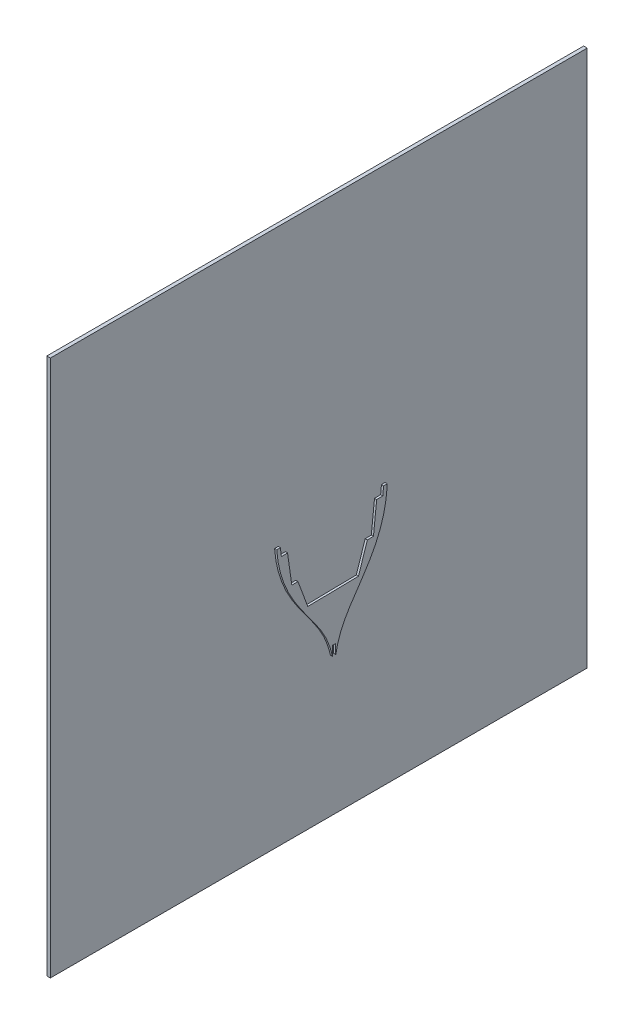
ISO-10303-21;
HEADER;
FILE_DESCRIPTION(('STEP AP214'),'2;1');
FILE_NAME('part.step','',(''),(''),'','','');
FILE_SCHEMA(('AUTOMOTIVE_DESIGN { 1 0 10303 214 1 1 1 1 }'));
ENDSEC;
DATA;
#1=APPLICATION_CONTEXT('core data for automotive mechanical design processes');
#2=APPLICATION_PROTOCOL_DEFINITION('international standard','automotive_design',2000,#1);
#3=PRODUCT_CONTEXT('',#1,'mechanical');
#4=PRODUCT('Part','Part','',(#3));
#5=PRODUCT_RELATED_PRODUCT_CATEGORY('part','',(#4));
#6=PRODUCT_DEFINITION_FORMATION('','',#4);
#7=PRODUCT_DEFINITION_CONTEXT('part definition',#1,'design');
#8=PRODUCT_DEFINITION('design','',#6,#7);
#9=PRODUCT_DEFINITION_SHAPE('','',#8);
#10=(LENGTH_UNIT() NAMED_UNIT(*) SI_UNIT(.MILLI.,.METRE.));
#11=(NAMED_UNIT(*) PLANE_ANGLE_UNIT() SI_UNIT($,.RADIAN.));
#12=(NAMED_UNIT(*) SI_UNIT($,.STERADIAN.) SOLID_ANGLE_UNIT());
#13=UNCERTAINTY_MEASURE_WITH_UNIT(LENGTH_MEASURE(1.E-05),#10,'distance_accuracy_value','');
#14=(GEOMETRIC_REPRESENTATION_CONTEXT(3) GLOBAL_UNCERTAINTY_ASSIGNED_CONTEXT((#13)) GLOBAL_UNIT_ASSIGNED_CONTEXT((#10,
#11,#12)) REPRESENTATION_CONTEXT('',''));
#15=CARTESIAN_POINT('',(0.,0.,0.));
#16=DIRECTION('',(0.,0.,1.));
#17=DIRECTION('',(1.,0.,0.));
#18=AXIS2_PLACEMENT_3D('',#15,#16,#17);
#19=CARTESIAN_POINT('',(6.,357.083770949444,160.737313051744));
#20=CARTESIAN_POINT('',(6.,176.989338925301,147.791780291286));
#21=CARTESIAN_POINT('',(6.,131.135423655461,19.6326524294257));
#22=CARTESIAN_POINT('',(6.,60.3624224473287,14.586676597337));
#23=CARTESIAN_POINT('',(6.,0.,0.));
#24=B_SPLINE_CURVE_WITH_KNOTS('',4,(#19,#20,#21,#22,#23),.UNSPECIFIED.,.F.,.F.,(5,5),(0.,1.),.UNSPECIFIED.);
#25=DIRECTION('',(-1.,0.,0.));
#26=VECTOR('',#25,1.);
#27=SURFACE_OF_LINEAR_EXTRUSION('',#24,#26);
#28=CARTESIAN_POINT('',(0.,357.083770949444,160.737313051744));
#29=CARTESIAN_POINT('',(0.,176.989338925301,147.791780291286));
#30=CARTESIAN_POINT('',(0.,131.135423655461,19.6326524294257));
#31=CARTESIAN_POINT('',(0.,60.3624224473287,14.586676597337));
#32=CARTESIAN_POINT('',(0.,0.,0.));
#33=B_SPLINE_CURVE_WITH_KNOTS('',4,(#28,#29,#30,#31,#32),.UNSPECIFIED.,.F.,.F.,(5,5),(0.,1.),.UNSPECIFIED.);
#34=CARTESIAN_POINT('',(0.,357.083770949444,160.737313051744));
#35=VERTEX_POINT('',#34);
#36=CARTESIAN_POINT('',(0.,21.0240609851036,4.88233554721288));
#37=VERTEX_POINT('',#36);
#38=EDGE_CURVE('E192',#35,#37,#33,.T.);
#39=ORIENTED_EDGE('',*,*,#38,.T.);
#40=DIRECTION('',(1.,0.,0.));
#41=VECTOR('',#40,1.);
#42=CARTESIAN_POINT('',(0.,21.0240609851036,4.88233554721288));
#43=LINE('',#42,#41);
#44=CARTESIAN_POINT('',(6.,21.0240609851036,4.88233554721288));
#45=VERTEX_POINT('',#44);
#46=EDGE_CURVE('E198',#37,#45,#43,.T.);
#47=ORIENTED_EDGE('',*,*,#46,.T.);
#48=CARTESIAN_POINT('',(6.,357.083770949444,160.737313051744));
#49=VERTEX_POINT('',#48);
#50=EDGE_CURVE('E232',#49,#45,#24,.T.);
#51=ORIENTED_EDGE('',*,*,#50,.F.);
#52=DIRECTION('',(-1.,0.,0.));
#53=VECTOR('',#52,1.);
#54=CARTESIAN_POINT('',(6.,357.083770949444,160.737313051744));
#55=LINE('',#54,#53);
#56=EDGE_CURVE('E188',#49,#35,#55,.T.);
#57=ORIENTED_EDGE('',*,*,#56,.T.);
#58=EDGE_LOOP('',(#39,#47,#51,#57));
#59=FACE_BOUND('',#58,.T.);
#60=ADVANCED_FACE('F45',(#59),#27,.F.);
#61=CARTESIAN_POINT('',(6.,0.,0.));
#62=CARTESIAN_POINT('',(6.,60.8511304712013,-12.3908473577035));
#63=CARTESIAN_POINT('',(6.,131.760455742087,-14.870194395147));
#64=CARTESIAN_POINT('',(6.,182.226064033114,-141.284457750605));
#65=CARTESIAN_POINT('',(6.,362.671205325101,-147.6986801248));
#66=B_SPLINE_CURVE_WITH_KNOTS('',4,(#61,#62,#63,#64,#65),.UNSPECIFIED.,.F.,.F.,(5,5),(0.,1.),.UNSPECIFIED.);
#67=DIRECTION('',(-1.,0.,0.));
#68=VECTOR('',#67,1.);
#69=SURFACE_OF_LINEAR_EXTRUSION('',#66,#68);
#70=CARTESIAN_POINT('',(6.,21.1870993804056,-4.11766445278712));
#71=VERTEX_POINT('',#70);
#72=CARTESIAN_POINT('',(6.,362.671205325101,-147.6986801248));
#73=VERTEX_POINT('',#72);
#74=EDGE_CURVE('E128',#71,#73,#66,.T.);
#75=ORIENTED_EDGE('',*,*,#74,.F.);
#76=DIRECTION('',(1.,0.,0.));
#77=VECTOR('',#76,1.);
#78=CARTESIAN_POINT('',(0.,21.1870993804056,-4.11766445278712));
#79=LINE('',#78,#77);
#80=CARTESIAN_POINT('',(0.,21.1870993804056,-4.11766445278712));
#81=VERTEX_POINT('',#80);
#82=EDGE_CURVE('E322',#81,#71,#79,.T.);
#83=ORIENTED_EDGE('',*,*,#82,.F.);
#84=CARTESIAN_POINT('',(0.,0.,0.));
#85=CARTESIAN_POINT('',(0.,60.8511304712013,-12.3908473577035));
#86=CARTESIAN_POINT('',(0.,131.760455742087,-14.870194395147));
#87=CARTESIAN_POINT('',(0.,182.226064033114,-141.284457750605));
#88=CARTESIAN_POINT('',(0.,362.671205325101,-147.6986801248));
#89=B_SPLINE_CURVE_WITH_KNOTS('',4,(#84,#85,#86,#87,#88),.UNSPECIFIED.,.F.,.F.,(5,5),(0.,1.),.UNSPECIFIED.);
#90=CARTESIAN_POINT('',(0.,362.671205325101,-147.6986801248));
#91=VERTEX_POINT('',#90);
#92=EDGE_CURVE('E197',#81,#91,#89,.T.);
#93=ORIENTED_EDGE('',*,*,#92,.T.);
#94=DIRECTION('',(-1.,0.,0.));
#95=VECTOR('',#94,1.);
#96=CARTESIAN_POINT('',(6.,362.671205325101,-147.6986801248));
#97=LINE('',#96,#95);
#98=EDGE_CURVE('E13',#73,#91,#97,.T.);
#99=ORIENTED_EDGE('',*,*,#98,.F.);
#100=EDGE_LOOP('',(#75,#83,#93,#99));
#101=FACE_BOUND('',#100,.T.);
#102=ADVANCED_FACE('F334',(#101),#69,.F.);
#103=CARTESIAN_POINT('',(6.,362.671205325101,-147.6986801248));
#104=DIRECTION('',(0.,-0.999835956927465,-0.0181124055536444));
#105=DIRECTION('',(0.,0.0181124055536444,-0.999835956927465));
#106=AXIS2_PLACEMENT_3D('',#103,#104,#105);
#107=PLANE('',#106);
#108=DIRECTION('',(0.,-0.0181124055536444,0.999835956927465));
#109=VECTOR('',#108,1.);
#110=CARTESIAN_POINT('',(0.,362.671205325101,-147.6986801248));
#111=LINE('',#110,#109);
#112=CARTESIAN_POINT('',(0.,362.490051552543,-137.6986801248));
#113=VERTEX_POINT('',#112);
#114=EDGE_CURVE('E205',#91,#113,#111,.T.);
#115=ORIENTED_EDGE('',*,*,#114,.T.);
#116=DIRECTION('',(-1.,0.,0.));
#117=VECTOR('',#116,1.);
#118=CARTESIAN_POINT('',(6.,362.490051552543,-137.6986801248));
#119=LINE('',#118,#117);
#120=CARTESIAN_POINT('',(6.,362.490051552543,-137.6986801248));
#121=VERTEX_POINT('',#120);
#122=EDGE_CURVE('E53',#121,#113,#119,.T.);
#123=ORIENTED_EDGE('',*,*,#122,.F.);
#124=DIRECTION('',(0.,-0.0181124055536444,0.999835956927465));
#125=VECTOR('',#124,1.);
#126=CARTESIAN_POINT('',(6.,362.671205325101,-147.6986801248));
#127=LINE('',#126,#125);
#128=EDGE_CURVE('E316',#73,#121,#127,.T.);
#129=ORIENTED_EDGE('',*,*,#128,.F.);
#130=ORIENTED_EDGE('',*,*,#98,.T.);
#131=EDGE_LOOP('',(#115,#123,#129,#130));
#132=FACE_BOUND('',#131,.T.);
#133=ADVANCED_FACE('F337',(#132),#107,.F.);
#134=CARTESIAN_POINT('',(6.,362.490051552543,-137.6986801248));
#135=DIRECTION('',(0.,-0.0934536370438815,-0.995623632565675));
#136=DIRECTION('',(0.,0.995623632565675,-0.0934536370438815));
#137=AXIS2_PLACEMENT_3D('',#134,#135,#136);
#138=PLANE('',#137);
#139=DIRECTION('',(0.,-0.995623632565675,0.0934536370438815));
#140=VECTOR('',#139,1.);
#141=CARTESIAN_POINT('',(0.,362.490051552543,-137.6986801248));
#142=LINE('',#141,#140);
#143=CARTESIAN_POINT('',(0.,339.299509240641,-135.521913269154));
#144=VERTEX_POINT('',#143);
#145=EDGE_CURVE('E210',#113,#144,#142,.T.);
#146=ORIENTED_EDGE('',*,*,#145,.T.);
#147=DIRECTION('',(-1.,0.,0.));
#148=VECTOR('',#147,1.);
#149=CARTESIAN_POINT('',(6.,339.299509240641,-135.521913269154));
#150=LINE('',#149,#148);
#151=CARTESIAN_POINT('',(6.,339.299509240641,-135.521913269154));
#152=VERTEX_POINT('',#151);
#153=EDGE_CURVE('E257',#152,#144,#150,.T.);
#154=ORIENTED_EDGE('',*,*,#153,.F.);
#155=DIRECTION('',(0.,-0.995623632565675,0.0934536370438815));
#156=VECTOR('',#155,1.);
#157=CARTESIAN_POINT('',(6.,362.490051552543,-137.6986801248));
#158=LINE('',#157,#156);
#159=EDGE_CURVE('E266',#121,#152,#158,.T.);
#160=ORIENTED_EDGE('',*,*,#159,.F.);
#161=ORIENTED_EDGE('',*,*,#122,.T.);
#162=EDGE_LOOP('',(#146,#154,#160,#161));
#163=FACE_BOUND('',#162,.T.);
#164=ADVANCED_FACE('F264',(#163),#138,.F.);
#165=CARTESIAN_POINT('',(6.,339.299509240641,-135.521913269154));
#166=DIRECTION('',(0.,-0.999835956927465,-0.018112405553646));
#167=DIRECTION('',(0.,0.018112405553646,-0.999835956927465));
#168=AXIS2_PLACEMENT_3D('',#165,#166,#167);
#169=PLANE('',#168);
#170=DIRECTION('',(0.,-0.018112405553646,0.999835956927465));
#171=VECTOR('',#170,1.);
#172=CARTESIAN_POINT('',(0.,339.299509240641,-135.521913269154));
#173=LINE('',#172,#171);
#174=CARTESIAN_POINT('',(0.,338.989543659627,-118.411279764967));
#175=VERTEX_POINT('',#174);
#176=EDGE_CURVE('E212',#144,#175,#173,.T.);
#177=ORIENTED_EDGE('',*,*,#176,.T.);
#178=DIRECTION('',(-1.,0.,0.));
#179=VECTOR('',#178,1.);
#180=CARTESIAN_POINT('',(6.,338.989543659627,-118.411279764967));
#181=LINE('',#180,#179);
#182=CARTESIAN_POINT('',(6.,338.989543659627,-118.411279764967));
#183=VERTEX_POINT('',#182);
#184=EDGE_CURVE('E254',#183,#175,#181,.T.);
#185=ORIENTED_EDGE('',*,*,#184,.F.);
#186=DIRECTION('',(0.,-0.018112405553646,0.999835956927465));
#187=VECTOR('',#186,1.);
#188=CARTESIAN_POINT('',(6.,339.299509240641,-135.521913269154));
#189=LINE('',#188,#187);
#190=EDGE_CURVE('E287',#152,#183,#189,.T.);
#191=ORIENTED_EDGE('',*,*,#190,.F.);
#192=ORIENTED_EDGE('',*,*,#153,.T.);
#193=EDGE_LOOP('',(#177,#185,#191,#192));
#194=FACE_BOUND('',#193,.T.);
#195=ADVANCED_FACE('F278',(#194),#169,.F.);
#196=CARTESIAN_POINT('',(6.,338.989543659627,-118.411279764967));
#197=DIRECTION('',(0.,-0.105655967210227,-0.994402743657152));
#198=DIRECTION('',(0.,0.994402743657152,-0.105655967210227));
#199=AXIS2_PLACEMENT_3D('',#196,#197,#198);
#200=PLANE('',#199);
#201=DIRECTION('',(0.,-0.994402743657152,0.105655967210227));
#202=VECTOR('',#201,1.);
#203=CARTESIAN_POINT('',(0.,338.989543659627,-118.411279764967));
#204=LINE('',#203,#202);
#205=CARTESIAN_POINT('',(0.,254.603893017863,-109.44524704423));
#206=VERTEX_POINT('',#205);
#207=EDGE_CURVE('E214',#175,#206,#204,.T.);
#208=ORIENTED_EDGE('',*,*,#207,.T.);
#209=DIRECTION('',(-1.,0.,0.));
#210=VECTOR('',#209,1.);
#211=CARTESIAN_POINT('',(6.,254.603893017863,-109.44524704423));
#212=LINE('',#211,#210);
#213=CARTESIAN_POINT('',(6.,254.603893017863,-109.44524704423));
#214=VERTEX_POINT('',#213);
#215=EDGE_CURVE('E251',#214,#206,#212,.T.);
#216=ORIENTED_EDGE('',*,*,#215,.F.);
#217=DIRECTION('',(0.,-0.994402743657152,0.105655967210227));
#218=VECTOR('',#217,1.);
#219=CARTESIAN_POINT('',(6.,338.989543659627,-118.411279764967));
#220=LINE('',#219,#218);
#221=EDGE_CURVE('E284',#183,#214,#220,.T.);
#222=ORIENTED_EDGE('',*,*,#221,.F.);
#223=ORIENTED_EDGE('',*,*,#184,.T.);
#224=EDGE_LOOP('',(#208,#216,#222,#223));
#225=FACE_BOUND('',#224,.T.);
#226=ADVANCED_FACE('F282',(#225),#200,.F.);
#227=CARTESIAN_POINT('',(6.,254.603893017863,-109.44524704423));
#228=DIRECTION('',(0.,-0.999835956927465,-0.0181124055536383));
#229=DIRECTION('',(0.,0.0181124055536383,-0.999835956927465));
#230=AXIS2_PLACEMENT_3D('',#227,#228,#229);
#231=PLANE('',#230);
#232=DIRECTION('',(0.,-0.0181124055536383,0.999835956927466));
#233=VECTOR('',#232,1.);
#234=CARTESIAN_POINT('',(0.,254.603893017863,-109.44524704423));
#235=LINE('',#234,#233);
#236=CARTESIAN_POINT('',(0.,254.294640162124,-92.3739572017596));
#237=VERTEX_POINT('',#236);
#238=EDGE_CURVE('E216',#206,#237,#235,.T.);
#239=ORIENTED_EDGE('',*,*,#238,.T.);
#240=DIRECTION('',(-1.,0.,0.));
#241=VECTOR('',#240,1.);
#242=CARTESIAN_POINT('',(6.,254.294640162124,-92.3739572017596));
#243=LINE('',#242,#241);
#244=CARTESIAN_POINT('',(6.,254.294640162124,-92.3739572017596));
#245=VERTEX_POINT('',#244);
#246=EDGE_CURVE('E248',#245,#237,#243,.T.);
#247=ORIENTED_EDGE('',*,*,#246,.F.);
#248=DIRECTION('',(0.,-0.0181124055536383,0.999835956927466));
#249=VECTOR('',#248,1.);
#250=CARTESIAN_POINT('',(6.,254.603893017863,-109.44524704423));
#251=LINE('',#250,#249);
#252=EDGE_CURVE('E286',#214,#245,#251,.T.);
#253=ORIENTED_EDGE('',*,*,#252,.F.);
#254=ORIENTED_EDGE('',*,*,#215,.T.);
#255=EDGE_LOOP('',(#239,#247,#253,#254));
#256=FACE_BOUND('',#255,.T.);
#257=ADVANCED_FACE('F347',(#256),#231,.F.);
#258=CARTESIAN_POINT('',(6.,254.294640162124,-92.3739572017596));
#259=DIRECTION('',(0.,-0.313276696283796,-0.949661893289138));
#260=DIRECTION('',(0.,0.949661893289138,-0.313276696283796));
#261=AXIS2_PLACEMENT_3D('',#258,#259,#260);
#262=PLANE('',#261);
#263=DIRECTION('',(0.,-0.949661893289138,0.313276696283796));
#264=VECTOR('',#263,1.);
#265=CARTESIAN_POINT('',(0.,254.294640162124,-92.3739572017596));
#266=LINE('',#265,#264);
#267=CARTESIAN_POINT('',(0.,179.082154003121,-67.5626855800508));
#268=VERTEX_POINT('',#267);
#269=EDGE_CURVE('E218',#237,#268,#266,.T.);
#270=ORIENTED_EDGE('',*,*,#269,.T.);
#271=DIRECTION('',(-1.,0.,0.));
#272=VECTOR('',#271,1.);
#273=CARTESIAN_POINT('',(6.,179.082154003121,-67.5626855800508));
#274=LINE('',#273,#272);
#275=CARTESIAN_POINT('',(6.,179.082154003121,-67.5626855800508));
#276=VERTEX_POINT('',#275);
#277=EDGE_CURVE('E245',#276,#268,#274,.T.);
#278=ORIENTED_EDGE('',*,*,#277,.F.);
#279=DIRECTION('',(0.,-0.949661893289138,0.313276696283796));
#280=VECTOR('',#279,1.);
#281=CARTESIAN_POINT('',(6.,254.294640162124,-92.3739572017596));
#282=LINE('',#281,#280);
#283=EDGE_CURVE('E289',#245,#276,#282,.T.);
#284=ORIENTED_EDGE('',*,*,#283,.F.);
#285=ORIENTED_EDGE('',*,*,#246,.T.);
#286=EDGE_LOOP('',(#270,#278,#284,#285));
#287=FACE_BOUND('',#286,.T.);
#288=ADVANCED_FACE('F350',(#287),#262,.F.);
#289=CARTESIAN_POINT('',(6.,179.082154003121,-67.5626855800508));
#290=DIRECTION('',(0.,-0.999835956927465,-0.0181124055536432));
#291=DIRECTION('',(0.,0.0181124055536432,-0.999835956927466));
#292=AXIS2_PLACEMENT_3D('',#289,#290,#291);
#293=PLANE('',#292);
#294=DIRECTION('',(0.,-0.0181124055536432,0.999835956927465));
#295=VECTOR('',#294,1.);
#296=CARTESIAN_POINT('',(0.,179.082154003121,-67.5626855800508));
#297=LINE('',#296,#295);
#298=CARTESIAN_POINT('',(0.,176.517610857699,74.0045094725739));
#299=VERTEX_POINT('',#298);
#300=EDGE_CURVE('E220',#268,#299,#297,.T.);
#301=ORIENTED_EDGE('',*,*,#300,.T.);
#302=DIRECTION('',(-1.,0.,0.));
#303=VECTOR('',#302,1.);
#304=CARTESIAN_POINT('',(6.,176.517610857699,74.0045094725739));
#305=LINE('',#304,#303);
#306=CARTESIAN_POINT('',(6.,176.517610857699,74.0045094725739));
#307=VERTEX_POINT('',#306);
#308=EDGE_CURVE('E242',#307,#299,#305,.T.);
#309=ORIENTED_EDGE('',*,*,#308,.F.);
#310=DIRECTION('',(0.,-0.0181124055536432,0.999835956927465));
#311=VECTOR('',#310,1.);
#312=CARTESIAN_POINT('',(6.,179.082154003121,-67.5626855800508));
#313=LINE('',#312,#311);
#314=EDGE_CURVE('E295',#276,#307,#313,.T.);
#315=ORIENTED_EDGE('',*,*,#314,.F.);
#316=ORIENTED_EDGE('',*,*,#277,.T.);
#317=EDGE_LOOP('',(#301,#309,#315,#316));
#318=FACE_BOUND('',#317,.T.);
#319=ADVANCED_FACE('F354',(#318),#293,.F.);
#320=CARTESIAN_POINT('',(6.,250.782112526767,101.523613119847));
#321=DIRECTION('',(0.,-0.347466829058695,0.937692275058239));
#322=DIRECTION('',(0.,-0.937692275058239,-0.347466829058695));
#323=AXIS2_PLACEMENT_3D('',#320,#321,#322);
#324=PLANE('',#323);
#325=DIRECTION('',(0.,0.937692275058239,0.347466829058695));
#326=VECTOR('',#325,1.);
#327=CARTESIAN_POINT('',(0.,250.782112526767,101.523613119847));
#328=LINE('',#327,#326);
#329=CARTESIAN_POINT('',(0.,250.782112526767,101.523613119847));
#330=VERTEX_POINT('',#329);
#331=EDGE_CURVE('E222',#299,#330,#328,.T.);
#332=ORIENTED_EDGE('',*,*,#331,.T.);
#333=DIRECTION('',(-1.,0.,0.));
#334=VECTOR('',#333,1.);
#335=CARTESIAN_POINT('',(6.,250.782112526767,101.523613119847));
#336=LINE('',#335,#334);
#337=CARTESIAN_POINT('',(6.,250.782112526767,101.523613119847));
#338=VERTEX_POINT('',#337);
#339=EDGE_CURVE('E239',#338,#330,#336,.T.);
#340=ORIENTED_EDGE('',*,*,#339,.F.);
#341=DIRECTION('',(0.,0.937692275058239,0.347466829058695));
#342=VECTOR('',#341,1.);
#343=CARTESIAN_POINT('',(6.,250.782112526767,101.523613119847));
#344=LINE('',#343,#342);
#345=EDGE_CURVE('E297',#307,#338,#344,.T.);
#346=ORIENTED_EDGE('',*,*,#345,.F.);
#347=ORIENTED_EDGE('',*,*,#308,.T.);
#348=EDGE_LOOP('',(#332,#340,#346,#347));
#349=FACE_BOUND('',#348,.T.);
#350=ADVANCED_FACE('F358',(#349),#324,.F.);
#351=CARTESIAN_POINT('',(6.,250.472859671028,118.594902962318));
#352=DIRECTION('',(0.,-0.999835956927465,-0.0181124055536448));
#353=DIRECTION('',(0.,0.0181124055536448,-0.999835956927465));
#354=AXIS2_PLACEMENT_3D('',#351,#352,#353);
#355=PLANE('',#354);
#356=DIRECTION('',(0.,-0.0181124055536448,0.999835956927465));
#357=VECTOR('',#356,1.);
#358=CARTESIAN_POINT('',(0.,250.472859671028,118.594902962318));
#359=LINE('',#358,#357);
#360=CARTESIAN_POINT('',(0.,250.472859671028,118.594902962318));
#361=VERTEX_POINT('',#360);
#362=EDGE_CURVE('E224',#330,#361,#359,.T.);
#363=ORIENTED_EDGE('',*,*,#362,.T.);
#364=DIRECTION('',(-1.,0.,0.));
#365=VECTOR('',#364,1.);
#366=CARTESIAN_POINT('',(6.,250.472859671028,118.594902962318));
#367=LINE('',#366,#365);
#368=CARTESIAN_POINT('',(6.,250.472859671028,118.594902962318));
#369=VERTEX_POINT('',#368);
#370=EDGE_CURVE('E236',#369,#361,#367,.T.);
#371=ORIENTED_EDGE('',*,*,#370,.F.);
#372=DIRECTION('',(0.,-0.0181124055536448,0.999835956927465));
#373=VECTOR('',#372,1.);
#374=CARTESIAN_POINT('',(6.,250.472859671028,118.594902962318));
#375=LINE('',#374,#373);
#376=EDGE_CURVE('E299',#338,#369,#375,.T.);
#377=ORIENTED_EDGE('',*,*,#376,.F.);
#378=ORIENTED_EDGE('',*,*,#339,.T.);
#379=EDGE_LOOP('',(#363,#371,#377,#378));
#380=FACE_BOUND('',#379,.T.);
#381=ADVANCED_FACE('F305',(#380),#355,.F.);
#382=CARTESIAN_POINT('',(6.,334.478403767138,130.611405702284));
#383=DIRECTION('',(0.,-0.141602786764219,0.989923558049109));
#384=DIRECTION('',(0.,-0.989923558049109,-0.141602786764219));
#385=AXIS2_PLACEMENT_3D('',#382,#383,#384);
#386=PLANE('',#385);
#387=DIRECTION('',(0.,0.989923558049109,0.141602786764219));
#388=VECTOR('',#387,1.);
#389=CARTESIAN_POINT('',(0.,334.478403767138,130.611405702284));
#390=LINE('',#389,#388);
#391=CARTESIAN_POINT('',(0.,334.478403767138,130.611405702284));
#392=VERTEX_POINT('',#391);
#393=EDGE_CURVE('E226',#361,#392,#390,.T.);
#394=ORIENTED_EDGE('',*,*,#393,.T.);
#395=DIRECTION('',(-1.,0.,0.));
#396=VECTOR('',#395,1.);
#397=CARTESIAN_POINT('',(6.,334.478403767138,130.611405702284));
#398=LINE('',#397,#396);
#399=CARTESIAN_POINT('',(6.,334.478403767138,130.611405702284));
#400=VERTEX_POINT('',#399);
#401=EDGE_CURVE('E183',#400,#392,#398,.T.);
#402=ORIENTED_EDGE('',*,*,#401,.F.);
#403=DIRECTION('',(0.,0.989923558049109,0.141602786764219));
#404=VECTOR('',#403,1.);
#405=CARTESIAN_POINT('',(6.,334.478403767138,130.611405702284));
#406=LINE('',#405,#404);
#407=EDGE_CURVE('E171',#369,#400,#406,.T.);
#408=ORIENTED_EDGE('',*,*,#407,.F.);
#409=ORIENTED_EDGE('',*,*,#370,.T.);
#410=EDGE_LOOP('',(#394,#402,#408,#409));
#411=FACE_BOUND('',#410,.T.);
#412=ADVANCED_FACE('F309',(#411),#386,.F.);
#413=CARTESIAN_POINT('',(6.,334.168438186124,147.722039206471));
#414=DIRECTION('',(0.,-0.999835956927465,-0.0181124055536396));
#415=DIRECTION('',(0.,0.0181124055536396,-0.999835956927465));
#416=AXIS2_PLACEMENT_3D('',#413,#414,#415);
#417=PLANE('',#416);
#418=DIRECTION('',(0.,-0.0181124055536396,0.999835956927466));
#419=VECTOR('',#418,1.);
#420=CARTESIAN_POINT('',(0.,334.168438186124,147.722039206471));
#421=LINE('',#420,#419);
#422=CARTESIAN_POINT('',(0.,334.168438186124,147.722039206471));
#423=VERTEX_POINT('',#422);
#424=EDGE_CURVE('E180',#392,#423,#421,.T.);
#425=ORIENTED_EDGE('',*,*,#424,.T.);
#426=DIRECTION('',(-1.,0.,0.));
#427=VECTOR('',#426,1.);
#428=CARTESIAN_POINT('',(6.,334.168438186124,147.722039206471));
#429=LINE('',#428,#427);
#430=CARTESIAN_POINT('',(6.,334.168438186124,147.722039206471));
#431=VERTEX_POINT('',#430);
#432=EDGE_CURVE('E177',#431,#423,#429,.T.);
#433=ORIENTED_EDGE('',*,*,#432,.F.);
#434=DIRECTION('',(0.,-0.0181124055536396,0.999835956927466));
#435=VECTOR('',#434,1.);
#436=CARTESIAN_POINT('',(6.,334.168438186124,147.722039206471));
#437=LINE('',#436,#435);
#438=EDGE_CURVE('E163',#400,#431,#437,.T.);
#439=ORIENTED_EDGE('',*,*,#438,.F.);
#440=ORIENTED_EDGE('',*,*,#401,.T.);
#441=EDGE_LOOP('',(#425,#433,#439,#440));
#442=FACE_BOUND('',#441,.T.);
#443=ADVANCED_FACE('F178',(#442),#417,.F.);
#444=CARTESIAN_POINT('',(6.,357.264924722002,150.737313051744));
#445=DIRECTION('',(0.,-0.129452681987119,0.99158560050373));
#446=DIRECTION('',(0.,-0.99158560050373,-0.129452681987119));
#447=AXIS2_PLACEMENT_3D('',#444,#445,#446);
#448=PLANE('',#447);
#449=DIRECTION('',(0.,0.991585600503729,0.129452681987119));
#450=VECTOR('',#449,1.);
#451=CARTESIAN_POINT('',(0.,357.264924722002,150.737313051744));
#452=LINE('',#451,#450);
#453=CARTESIAN_POINT('',(0.,357.264924722002,150.737313051744));
#454=VERTEX_POINT('',#453);
#455=EDGE_CURVE('E229',#423,#454,#452,.T.);
#456=ORIENTED_EDGE('',*,*,#455,.T.);
#457=DIRECTION('',(-1.,0.,0.));
#458=VECTOR('',#457,1.);
#459=CARTESIAN_POINT('',(6.,357.264924722002,150.737313051744));
#460=LINE('',#459,#458);
#461=CARTESIAN_POINT('',(6.,357.264924722002,150.737313051744));
#462=VERTEX_POINT('',#461);
#463=EDGE_CURVE('E184',#462,#454,#460,.T.);
#464=ORIENTED_EDGE('',*,*,#463,.F.);
#465=DIRECTION('',(0.,0.991585600503729,0.129452681987119));
#466=VECTOR('',#465,1.);
#467=CARTESIAN_POINT('',(6.,357.264924722002,150.737313051744));
#468=LINE('',#467,#466);
#469=EDGE_CURVE('E168',#431,#462,#468,.T.);
#470=ORIENTED_EDGE('',*,*,#469,.F.);
#471=ORIENTED_EDGE('',*,*,#432,.T.);
#472=EDGE_LOOP('',(#456,#464,#470,#471));
#473=FACE_BOUND('',#472,.T.);
#474=ADVANCED_FACE('F186',(#473),#448,.F.);
#475=CARTESIAN_POINT('',(6.,357.083770949444,160.737313051744));
#476=DIRECTION('',(0.,-0.999835956927465,-0.0181124055536443));
#477=DIRECTION('',(0.,0.0181124055536443,-0.999835956927465));
#478=AXIS2_PLACEMENT_3D('',#475,#476,#477);
#479=PLANE('',#478);
#480=DIRECTION('',(0.,-0.0181124055536443,0.999835956927465));
#481=VECTOR('',#480,1.);
#482=CARTESIAN_POINT('',(0.,357.083770949444,160.737313051744));
#483=LINE('',#482,#481);
#484=EDGE_CURVE('E120',#454,#35,#483,.T.);
#485=ORIENTED_EDGE('',*,*,#484,.T.);
#486=ORIENTED_EDGE('',*,*,#56,.F.);
#487=DIRECTION('',(0.,-0.0181124055536443,0.999835956927465));
#488=VECTOR('',#487,1.);
#489=CARTESIAN_POINT('',(6.,357.083770949444,160.737313051744));
#490=LINE('',#489,#488);
#491=EDGE_CURVE('E69',#462,#49,#490,.T.);
#492=ORIENTED_EDGE('',*,*,#491,.F.);
#493=ORIENTED_EDGE('',*,*,#463,.T.);
#494=EDGE_LOOP('',(#485,#486,#492,#493));
#495=FACE_BOUND('',#494,.T.);
#496=ADVANCED_FACE('F311',(#495),#479,.F.);
#497=CARTESIAN_POINT('',(6.,130.831459898296,58.0029409489244));
#498=DIRECTION('',(1.,0.,0.));
#499=DIRECTION('',(0.,0.,-1.));
#500=AXIS2_PLACEMENT_3D('',#497,#498,#499);
#501=PLANE('',#500);
#502=DIRECTION('',(0.,-0.999835956927465,-0.018112405553643));
#503=VECTOR('',#502,1.);
#504=CARTESIAN_POINT('',(6.,21.0240609851036,4.88233554721288));
#505=LINE('',#504,#503);
#506=CARTESIAN_POINT('',(6.,48.0240609851035,5.37145073311916));
#507=VERTEX_POINT('',#506);
#508=EDGE_CURVE('E510',#507,#45,#505,.T.);
#509=ORIENTED_EDGE('',*,*,#508,.F.);
#510=DIRECTION('',(0.,-0.0181124055536438,0.999835956927465));
#511=VECTOR('',#510,1.);
#512=CARTESIAN_POINT('',(6.,48.0240609851035,5.37145073311916));
#513=LINE('',#512,#511);
#514=CARTESIAN_POINT('',(6.,48.1870993804056,-3.62854926688084));
#515=VERTEX_POINT('',#514);
#516=EDGE_CURVE('E519',#515,#507,#513,.T.);
#517=ORIENTED_EDGE('',*,*,#516,.F.);
#518=DIRECTION('',(0.,0.999835956927465,0.0181124055536428));
#519=VECTOR('',#518,1.);
#520=CARTESIAN_POINT('',(6.,48.1870993804056,-3.62854926688084));
#521=LINE('',#520,#519);
#522=EDGE_CURVE('E523',#71,#515,#521,.T.);
#523=ORIENTED_EDGE('',*,*,#522,.F.);
#524=ORIENTED_EDGE('',*,*,#74,.T.);
#525=ORIENTED_EDGE('',*,*,#128,.T.);
#526=ORIENTED_EDGE('',*,*,#159,.T.);
#527=ORIENTED_EDGE('',*,*,#190,.T.);
#528=ORIENTED_EDGE('',*,*,#221,.T.);
#529=ORIENTED_EDGE('',*,*,#252,.T.);
#530=ORIENTED_EDGE('',*,*,#283,.T.);
#531=ORIENTED_EDGE('',*,*,#314,.T.);
#532=ORIENTED_EDGE('',*,*,#345,.T.);
#533=ORIENTED_EDGE('',*,*,#376,.T.);
#534=ORIENTED_EDGE('',*,*,#407,.T.);
#535=ORIENTED_EDGE('',*,*,#438,.T.);
#536=ORIENTED_EDGE('',*,*,#469,.T.);
#537=ORIENTED_EDGE('',*,*,#491,.T.);
#538=ORIENTED_EDGE('',*,*,#50,.T.);
#539=EDGE_LOOP('',(#509,#517,#523,#524,#525,#526,#527,#528,#529,#530,#531,#532,#533,#534,#535,
#536,#537,#538));
#540=FACE_BOUND('',#539,.T.);
#541=ADVANCED_FACE('F166',(#540),#501,.T.);
#542=CARTESIAN_POINT('',(0.,130.831459898296,58.0029409489244));
#543=DIRECTION('',(1.,0.,0.));
#544=DIRECTION('',(0.,0.,-1.));
#545=AXIS2_PLACEMENT_3D('',#542,#543,#544);
#546=PLANE('',#545);
#547=DIRECTION('',(0.,-0.0181124055536438,0.999835956927465));
#548=VECTOR('',#547,1.);
#549=CARTESIAN_POINT('',(0.,48.0240609851035,5.37145073311916));
#550=LINE('',#549,#548);
#551=CARTESIAN_POINT('',(0.,48.1870993804056,-3.62854926688083));
#552=VERTEX_POINT('',#551);
#553=CARTESIAN_POINT('',(0.,48.0240609851035,5.37145073311916));
#554=VERTEX_POINT('',#553);
#555=EDGE_CURVE('E60',#552,#554,#550,.T.);
#556=ORIENTED_EDGE('',*,*,#555,.T.);
#557=DIRECTION('',(0.,-0.999835956927465,-0.018112405553643));
#558=VECTOR('',#557,1.);
#559=CARTESIAN_POINT('',(0.,21.0240609851036,4.88233554721288));
#560=LINE('',#559,#558);
#561=EDGE_CURVE('E532',#554,#37,#560,.T.);
#562=ORIENTED_EDGE('',*,*,#561,.T.);
#563=ORIENTED_EDGE('',*,*,#38,.F.);
#564=ORIENTED_EDGE('',*,*,#484,.F.);
#565=ORIENTED_EDGE('',*,*,#455,.F.);
#566=ORIENTED_EDGE('',*,*,#424,.F.);
#567=ORIENTED_EDGE('',*,*,#393,.F.);
#568=ORIENTED_EDGE('',*,*,#362,.F.);
#569=ORIENTED_EDGE('',*,*,#331,.F.);
#570=ORIENTED_EDGE('',*,*,#300,.F.);
#571=ORIENTED_EDGE('',*,*,#269,.F.);
#572=ORIENTED_EDGE('',*,*,#238,.F.);
#573=ORIENTED_EDGE('',*,*,#207,.F.);
#574=ORIENTED_EDGE('',*,*,#176,.F.);
#575=ORIENTED_EDGE('',*,*,#145,.F.);
#576=ORIENTED_EDGE('',*,*,#114,.F.);
#577=ORIENTED_EDGE('',*,*,#92,.F.);
#578=DIRECTION('',(0.,0.999835956927465,0.0181124055536428));
#579=VECTOR('',#578,1.);
#580=CARTESIAN_POINT('',(0.,48.1870993804056,-3.62854926688084));
#581=LINE('',#580,#579);
#582=EDGE_CURVE('E518',#81,#552,#581,.T.);
#583=ORIENTED_EDGE('',*,*,#582,.T.);
#584=EDGE_LOOP('',(#556,#562,#563,#564,#565,#566,#567,#568,#569,#570,#571,#572,#573,#574,#575,
#576,#577,#583));
#585=FACE_BOUND('',#584,.T.);
#586=ADVANCED_FACE('F272',(#585),#546,.F.);
#587=CARTESIAN_POINT('',(0.,21.0240609851036,4.88233554721288));
#588=DIRECTION('',(0.,-0.018112405553643,0.999835956927465));
#589=DIRECTION('',(0.,-0.999835956927466,-0.018112405553643));
#590=AXIS2_PLACEMENT_3D('',#587,#588,#589);
#591=PLANE('',#590);
#592=ORIENTED_EDGE('',*,*,#508,.T.);
#593=ORIENTED_EDGE('',*,*,#46,.F.);
#594=ORIENTED_EDGE('',*,*,#561,.F.);
#595=DIRECTION('',(1.,0.,0.));
#596=VECTOR('',#595,1.);
#597=CARTESIAN_POINT('',(0.,48.0240609851035,5.37145073311916));
#598=LINE('',#597,#596);
#599=EDGE_CURVE('E514',#554,#507,#598,.T.);
#600=ORIENTED_EDGE('',*,*,#599,.T.);
#601=EDGE_LOOP('',(#592,#593,#594,#600));
#602=FACE_BOUND('',#601,.T.);
#603=ADVANCED_FACE('F375',(#602),#591,.F.);
#604=CARTESIAN_POINT('',(0.,48.0240609851035,5.37145073311916));
#605=DIRECTION('',(0.,0.999835956927465,0.0181124055536438));
#606=DIRECTION('',(0.,-0.0181124055536438,0.999835956927466));
#607=AXIS2_PLACEMENT_3D('',#604,#605,#606);
#608=PLANE('',#607);
#609=ORIENTED_EDGE('',*,*,#516,.T.);
#610=ORIENTED_EDGE('',*,*,#599,.F.);
#611=ORIENTED_EDGE('',*,*,#555,.F.);
#612=DIRECTION('',(1.,0.,0.));
#613=VECTOR('',#612,1.);
#614=CARTESIAN_POINT('',(0.,48.1870993804056,-3.62854926688084));
#615=LINE('',#614,#613);
#616=EDGE_CURVE('E528',#552,#515,#615,.T.);
#617=ORIENTED_EDGE('',*,*,#616,.T.);
#618=EDGE_LOOP('',(#609,#610,#611,#617));
#619=FACE_BOUND('',#618,.T.);
#620=ADVANCED_FACE('F381',(#619),#608,.F.);
#621=CARTESIAN_POINT('',(0.,48.1870993804056,-3.62854926688084));
#622=DIRECTION('',(0.,0.0181124055536428,-0.999835956927465));
#623=DIRECTION('',(0.,0.999835956927466,0.0181124055536428));
#624=AXIS2_PLACEMENT_3D('',#621,#622,#623);
#625=PLANE('',#624);
#626=ORIENTED_EDGE('',*,*,#522,.T.);
#627=ORIENTED_EDGE('',*,*,#616,.F.);
#628=ORIENTED_EDGE('',*,*,#582,.F.);
#629=ORIENTED_EDGE('',*,*,#82,.T.);
#630=EDGE_LOOP('',(#626,#627,#628,#629));
#631=FACE_BOUND('',#630,.T.);
#632=ADVANCED_FACE('F378',(#631),#625,.F.);
#633=CLOSED_SHELL('',(#60,#102,#133,#164,#195,#226,#257,#288,#319,#350,#381,#412,#443,#474,#496,
#541,#586,#603,#620,#632));
#634=MANIFOLD_SOLID_BREP('B2',#633);
#635=CARTESIAN_POINT('',(-10.,0.,0.));
#636=DIRECTION('',(-1.,0.,0.));
#637=DIRECTION('',(0.,0.,1.));
#638=AXIS2_PLACEMENT_3D('',#635,#636,#637);
#639=PLANE('',#638);
#640=DIRECTION('',(0.,0.,-1.));
#641=VECTOR('',#640,1.);
#642=CARTESIAN_POINT('',(-10.,-378.710653275796,777.274991403029));
#643=LINE('',#642,#641);
#644=CARTESIAN_POINT('',(-10.,-378.710653275796,777.274991403029));
#645=VERTEX_POINT('',#644);
#646=CARTESIAN_POINT('',(-10.,-378.710653275796,-722.725008596971));
#647=VERTEX_POINT('',#646);
#648=EDGE_CURVE('E563',#645,#647,#643,.T.);
#649=ORIENTED_EDGE('',*,*,#648,.T.);
#650=DIRECTION('',(0.,-1.,0.));
#651=VECTOR('',#650,1.);
#652=CARTESIAN_POINT('',(-10.,1121.2893467242,-722.725008596971));
#653=LINE('',#652,#651);
#654=CARTESIAN_POINT('',(-10.,1121.2893467242,-722.725008596971));
#655=VERTEX_POINT('',#654);
#656=EDGE_CURVE('E597',#655,#647,#653,.T.);
#657=ORIENTED_EDGE('',*,*,#656,.F.);
#658=DIRECTION('',(0.,0.,-1.));
#659=VECTOR('',#658,1.);
#660=CARTESIAN_POINT('',(-10.,1121.2893467242,777.274991403029));
#661=LINE('',#660,#659);
#662=CARTESIAN_POINT('',(-10.,1121.2893467242,777.274991403029));
#663=VERTEX_POINT('',#662);
#664=EDGE_CURVE('E594',#663,#655,#661,.T.);
#665=ORIENTED_EDGE('',*,*,#664,.F.);
#666=DIRECTION('',(0.,-1.,0.));
#667=VECTOR('',#666,1.);
#668=CARTESIAN_POINT('',(-10.,1121.2893467242,777.274991403029));
#669=LINE('',#668,#667);
#670=EDGE_CURVE('E591',#663,#645,#669,.T.);
#671=ORIENTED_EDGE('',*,*,#670,.T.);
#672=EDGE_LOOP('',(#649,#657,#665,#671));
#673=FACE_BOUND('',#672,.T.);
#674=ADVANCED_FACE('F554',(#673),#639,.F.);
#675=CARTESIAN_POINT('',(-20.,0.,0.));
#676=DIRECTION('',(-1.,0.,0.));
#677=DIRECTION('',(0.,0.,1.));
#678=AXIS2_PLACEMENT_3D('',#675,#676,#677);
#679=PLANE('',#678);
#680=DIRECTION('',(0.,0.,-1.));
#681=VECTOR('',#680,1.);
#682=CARTESIAN_POINT('',(-20.,-378.710653275796,777.274991403029));
#683=LINE('',#682,#681);
#684=CARTESIAN_POINT('',(-20.,-378.710653275796,777.274991403029));
#685=VERTEX_POINT('',#684);
#686=CARTESIAN_POINT('',(-20.,-378.710653275796,-722.725008596971));
#687=VERTEX_POINT('',#686);
#688=EDGE_CURVE('E43',#685,#687,#683,.T.);
#689=ORIENTED_EDGE('',*,*,#688,.F.);
#690=DIRECTION('',(0.,-1.,0.));
#691=VECTOR('',#690,1.);
#692=CARTESIAN_POINT('',(-20.,1121.2893467242,777.274991403029));
#693=LINE('',#692,#691);
#694=CARTESIAN_POINT('',(-20.,1121.2893467242,777.274991403029));
#695=VERTEX_POINT('',#694);
#696=EDGE_CURVE('E610',#695,#685,#693,.T.);
#697=ORIENTED_EDGE('',*,*,#696,.F.);
#698=DIRECTION('',(0.,0.,-1.));
#699=VECTOR('',#698,1.);
#700=CARTESIAN_POINT('',(-20.,1121.2893467242,777.274991403029));
#701=LINE('',#700,#699);
#702=CARTESIAN_POINT('',(-20.,1121.2893467242,-722.725008596971));
#703=VERTEX_POINT('',#702);
#704=EDGE_CURVE('E601',#695,#703,#701,.T.);
#705=ORIENTED_EDGE('',*,*,#704,.T.);
#706=DIRECTION('',(0.,-1.,0.));
#707=VECTOR('',#706,1.);
#708=CARTESIAN_POINT('',(-20.,1121.2893467242,-722.725008596971));
#709=LINE('',#708,#707);
#710=EDGE_CURVE('E572',#703,#687,#709,.T.);
#711=ORIENTED_EDGE('',*,*,#710,.T.);
#712=EDGE_LOOP('',(#689,#697,#705,#711));
#713=FACE_BOUND('',#712,.T.);
#714=ADVANCED_FACE('F650',(#713),#679,.T.);
#715=CARTESIAN_POINT('',(-20.,1121.2893467242,777.274991403029));
#716=DIRECTION('',(0.,0.,1.));
#717=DIRECTION('',(1.,0.,0.));
#718=AXIS2_PLACEMENT_3D('',#715,#716,#717);
#719=PLANE('',#718);
#720=ORIENTED_EDGE('',*,*,#670,.F.);
#721=DIRECTION('',(1.,0.,0.));
#722=VECTOR('',#721,1.);
#723=CARTESIAN_POINT('',(-20.,1121.2893467242,777.274991403029));
#724=LINE('',#723,#722);
#725=EDGE_CURVE('E606',#695,#663,#724,.T.);
#726=ORIENTED_EDGE('',*,*,#725,.F.);
#727=ORIENTED_EDGE('',*,*,#696,.T.);
#728=DIRECTION('',(1.,0.,0.));
#729=VECTOR('',#728,1.);
#730=CARTESIAN_POINT('',(-20.,-378.710653275796,777.274991403029));
#731=LINE('',#730,#729);
#732=EDGE_CURVE('E602',#685,#645,#731,.T.);
#733=ORIENTED_EDGE('',*,*,#732,.T.);
#734=EDGE_LOOP('',(#720,#726,#727,#733));
#735=FACE_BOUND('',#734,.T.);
#736=ADVANCED_FACE('F611',(#735),#719,.T.);
#737=CARTESIAN_POINT('',(-20.,-378.710653275796,777.274991403029));
#738=DIRECTION('',(0.,-1.,0.));
#739=DIRECTION('',(0.,0.,-1.));
#740=AXIS2_PLACEMENT_3D('',#737,#738,#739);
#741=PLANE('',#740);
#742=ORIENTED_EDGE('',*,*,#648,.F.);
#743=ORIENTED_EDGE('',*,*,#732,.F.);
#744=ORIENTED_EDGE('',*,*,#688,.T.);
#745=DIRECTION('',(1.,0.,0.));
#746=VECTOR('',#745,1.);
#747=CARTESIAN_POINT('',(-20.,-378.710653275796,-722.725008596971));
#748=LINE('',#747,#746);
#749=EDGE_CURVE('E622',#687,#647,#748,.T.);
#750=ORIENTED_EDGE('',*,*,#749,.T.);
#751=EDGE_LOOP('',(#742,#743,#744,#750));
#752=FACE_BOUND('',#751,.T.);
#753=ADVANCED_FACE('F652',(#752),#741,.T.);
#754=CARTESIAN_POINT('',(-20.,1121.2893467242,777.274991403029));
#755=DIRECTION('',(0.,-1.,0.));
#756=DIRECTION('',(0.,0.,-1.));
#757=AXIS2_PLACEMENT_3D('',#754,#755,#756);
#758=PLANE('',#757);
#759=ORIENTED_EDGE('',*,*,#664,.T.);
#760=DIRECTION('',(1.,0.,0.));
#761=VECTOR('',#760,1.);
#762=CARTESIAN_POINT('',(-20.,1121.2893467242,-722.725008596971));
#763=LINE('',#762,#761);
#764=EDGE_CURVE('E626',#703,#655,#763,.T.);
#765=ORIENTED_EDGE('',*,*,#764,.F.);
#766=ORIENTED_EDGE('',*,*,#704,.F.);
#767=ORIENTED_EDGE('',*,*,#725,.T.);
#768=EDGE_LOOP('',(#759,#765,#766,#767));
#769=FACE_BOUND('',#768,.T.);
#770=ADVANCED_FACE('F607',(#769),#758,.F.);
#771=CARTESIAN_POINT('',(-20.,1121.2893467242,-722.725008596971));
#772=DIRECTION('',(0.,0.,1.));
#773=DIRECTION('',(1.,0.,0.));
#774=AXIS2_PLACEMENT_3D('',#771,#772,#773);
#775=PLANE('',#774);
#776=ORIENTED_EDGE('',*,*,#656,.T.);
#777=ORIENTED_EDGE('',*,*,#749,.F.);
#778=ORIENTED_EDGE('',*,*,#710,.F.);
#779=ORIENTED_EDGE('',*,*,#764,.T.);
#780=EDGE_LOOP('',(#776,#777,#778,#779));
#781=FACE_BOUND('',#780,.T.);
#782=ADVANCED_FACE('F637',(#781),#775,.F.);
#783=CLOSED_SHELL('',(#674,#714,#736,#753,#770,#782));
#784=MANIFOLD_SOLID_BREP('B7_NOT_SHOWN',#783);
#785=ADVANCED_BREP_SHAPE_REPRESENTATION('',(#18,#634,#784),#14);
#786=SHAPE_DEFINITION_REPRESENTATION(#9,#785);
ENDSEC;
END-ISO-10303-21;
